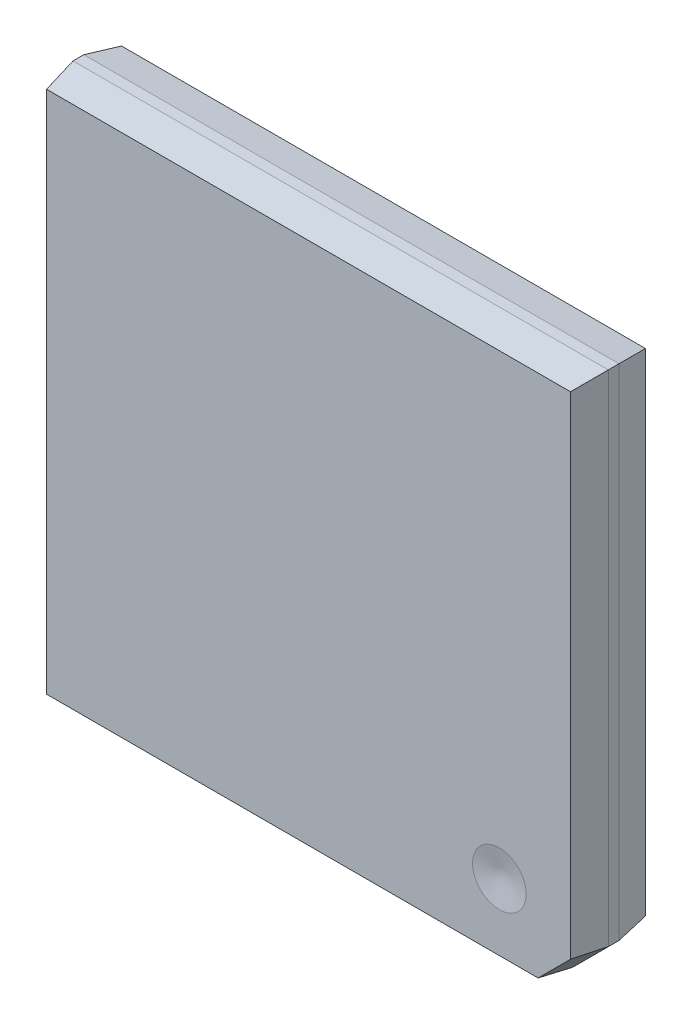
ISO-10303-21;
HEADER;
FILE_DESCRIPTION(('STEP AP214'),'2;1');
FILE_NAME('part.step','',(''),(''),'','','');
FILE_SCHEMA(('AUTOMOTIVE_DESIGN { 1 0 10303 214 1 1 1 1 }'));
ENDSEC;
DATA;
#1=APPLICATION_CONTEXT('core data for automotive mechanical design processes');
#2=APPLICATION_PROTOCOL_DEFINITION('international standard','automotive_design',2000,#1);
#3=PRODUCT_CONTEXT('',#1,'mechanical');
#4=PRODUCT('Part','Part','',(#3));
#5=PRODUCT_RELATED_PRODUCT_CATEGORY('part','',(#4));
#6=PRODUCT_DEFINITION_FORMATION('','',#4);
#7=PRODUCT_DEFINITION_CONTEXT('part definition',#1,'design');
#8=PRODUCT_DEFINITION('design','',#6,#7);
#9=PRODUCT_DEFINITION_SHAPE('','',#8);
#10=(LENGTH_UNIT() NAMED_UNIT(*) SI_UNIT(.MILLI.,.METRE.));
#11=(NAMED_UNIT(*) PLANE_ANGLE_UNIT() SI_UNIT($,.RADIAN.));
#12=(NAMED_UNIT(*) SI_UNIT($,.STERADIAN.) SOLID_ANGLE_UNIT());
#13=UNCERTAINTY_MEASURE_WITH_UNIT(LENGTH_MEASURE(1.E-05),#10,'distance_accuracy_value','');
#14=(GEOMETRIC_REPRESENTATION_CONTEXT(3) GLOBAL_UNCERTAINTY_ASSIGNED_CONTEXT((#13)) GLOBAL_UNIT_ASSIGNED_CONTEXT((#10,
#11,#12)) REPRESENTATION_CONTEXT('',''));
#15=CARTESIAN_POINT('',(0.,0.,0.));
#16=DIRECTION('',(0.,0.,1.));
#17=DIRECTION('',(1.,0.,0.));
#18=AXIS2_PLACEMENT_3D('',#15,#16,#17);
#19=CARTESIAN_POINT('',(3.56472313404083,-3.64965915679932,1.44999999999129));
#20=DIRECTION('',(0.,0.,1.));
#21=DIRECTION('',(1.,0.,0.));
#22=AXIS2_PLACEMENT_3D('',#19,#20,#21);
#23=CONICAL_SURFACE('',#22,0.499999999938157,1.39626340145883);
#24=CARTESIAN_POINT('',(3.56469270837351,-3.64965915679933,1.36210771992751));
#25=VERTEX_POINT('',#24);
#26=VERTEX_LOOP('',#25);
#27=FACE_BOUND('',#26,.T.);
#28=CARTESIAN_POINT('',(3.56472313404083,-3.64965915679932,1.45000000000131));
#29=DIRECTION('',(0.,0.,1.));
#30=DIRECTION('',(1.,0.,0.));
#31=AXIS2_PLACEMENT_3D('',#28,#29,#30);
#32=CIRCLE('',#31,0.499999999995001);
#33=CARTESIAN_POINT('',(4.06472313403583,-3.64965915679932,1.45000000000131));
#34=VERTEX_POINT('',#33);
#35=EDGE_CURVE('E20',#34,#34,#32,.T.);
#36=ORIENTED_EDGE('',*,*,#35,.T.);
#37=EDGE_LOOP('',(#36));
#38=FACE_BOUND('',#37,.T.);
#39=ADVANCED_FACE('F17',(#27,#38),#23,.F.);
#40=CARTESIAN_POINT('',(0.,0.,1.45));
#41=DIRECTION('',(0.,0.,-1.));
#42=DIRECTION('',(-1.,0.,0.));
#43=AXIS2_PLACEMENT_3D('',#40,#41,#42);
#44=PLANE('',#43);
#45=ORIENTED_EDGE('',*,*,#35,.F.);
#46=EDGE_LOOP('',(#45));
#47=FACE_BOUND('',#46,.T.);
#48=DIRECTION('',(1.,0.,0.));
#49=VECTOR('',#48,1.);
#50=CARTESIAN_POINT('',(-5.,-4.89420381157492,1.45));
#51=LINE('',#50,#49);
#52=CARTESIAN_POINT('',(-4.89420381157492,-4.89420381157492,1.45));
#53=VERTEX_POINT('',#52);
#54=CARTESIAN_POINT('',(4.28917778390695,-4.89420381157492,1.45));
#55=VERTEX_POINT('',#54);
#56=EDGE_CURVE('E95',#53,#55,#51,.T.);
#57=ORIENTED_EDGE('',*,*,#56,.T.);
#58=DIRECTION('',(-0.707106781186549,-0.707106781186546,0.));
#59=VECTOR('',#58,1.);
#60=CARTESIAN_POINT('',(4.25819079774094,-4.92519079774094,1.45));
#61=LINE('',#60,#59);
#62=CARTESIAN_POINT('',(4.89420381157492,-4.28917778390695,1.45));
#63=VERTEX_POINT('',#62);
#64=EDGE_CURVE('E106',#55,#63,#61,.F.);
#65=ORIENTED_EDGE('',*,*,#64,.T.);
#66=DIRECTION('',(0.,1.,0.));
#67=VECTOR('',#66,1.);
#68=CARTESIAN_POINT('',(4.89420381157492,-4.333,1.45));
#69=LINE('',#68,#67);
#70=CARTESIAN_POINT('',(4.89420381157492,4.89420381157492,1.45));
#71=VERTEX_POINT('',#70);
#72=EDGE_CURVE('E134',#63,#71,#69,.T.);
#73=ORIENTED_EDGE('',*,*,#72,.T.);
#74=DIRECTION('',(1.,0.,0.));
#75=VECTOR('',#74,1.);
#76=CARTESIAN_POINT('',(5.,4.89420381157492,1.45));
#77=LINE('',#76,#75);
#78=CARTESIAN_POINT('',(-4.89420381157492,4.89420381157492,1.45));
#79=VERTEX_POINT('',#78);
#80=EDGE_CURVE('E125',#71,#79,#77,.F.);
#81=ORIENTED_EDGE('',*,*,#80,.T.);
#82=DIRECTION('',(0.,1.,0.));
#83=VECTOR('',#82,1.);
#84=CARTESIAN_POINT('',(-4.89420381157492,5.,1.45));
#85=LINE('',#84,#83);
#86=EDGE_CURVE('E119',#79,#53,#85,.F.);
#87=ORIENTED_EDGE('',*,*,#86,.T.);
#88=EDGE_LOOP('',(#57,#65,#73,#81,#87));
#89=FACE_BOUND('',#88,.T.);
#90=ADVANCED_FACE('F101',(#47,#89),#44,.F.);
#91=CARTESIAN_POINT('',(4.333,-5.,0.85));
#92=DIRECTION('',(-0.696364240320018,0.69636424032002,-0.17364817766693));
#93=DIRECTION('',(-0.707106781186549,-0.707106781186546,0.));
#94=AXIS2_PLACEMENT_3D('',#91,#92,#93);
#95=PLANE('',#94);
#96=DIRECTION('',(-0.173200723896951,0.0717420888509582,0.982270116581418));
#97=VECTOR('',#96,1.);
#98=CARTESIAN_POINT('',(5.,-4.333,0.85));
#99=LINE('',#98,#97);
#100=CARTESIAN_POINT('',(5.,-4.333,0.85));
#101=VERTEX_POINT('',#100);
#102=EDGE_CURVE('E131',#101,#63,#99,.T.);
#103=ORIENTED_EDGE('',*,*,#102,.T.);
#104=ORIENTED_EDGE('',*,*,#64,.F.);
#105=DIRECTION('',(0.0717420888509554,-0.173200723896954,-0.982270116581418));
#106=VECTOR('',#105,1.);
#107=CARTESIAN_POINT('',(4.28917778390696,-4.89420381157492,1.45));
#108=LINE('',#107,#106);
#109=CARTESIAN_POINT('',(4.333,-5.,0.85));
#110=VERTEX_POINT('',#109);
#111=EDGE_CURVE('E115',#55,#110,#108,.T.);
#112=ORIENTED_EDGE('',*,*,#111,.T.);
#113=DIRECTION('',(0.707106781186548,0.707106781186547,0.));
#114=VECTOR('',#113,1.);
#115=CARTESIAN_POINT('',(5.,-4.333,0.85));
#116=LINE('',#115,#114);
#117=EDGE_CURVE('E140',#101,#110,#116,.F.);
#118=ORIENTED_EDGE('',*,*,#117,.F.);
#119=EDGE_LOOP('',(#103,#104,#112,#118));
#120=FACE_BOUND('',#119,.T.);
#121=ADVANCED_FACE('F271',(#120),#95,.F.);
#122=CARTESIAN_POINT('',(-5.,-5.,0.85));
#123=DIRECTION('',(0.,0.984807753012208,-0.173648177666931));
#124=DIRECTION('',(0.,0.173648177666931,0.984807753012208));
#125=AXIS2_PLACEMENT_3D('',#122,#123,#124);
#126=PLANE('',#125);
#127=ORIENTED_EDGE('',*,*,#111,.F.);
#128=ORIENTED_EDGE('',*,*,#56,.F.);
#129=DIRECTION('',(-0.171087869746036,-0.171087869746042,-0.970287525247813));
#130=VECTOR('',#129,1.);
#131=CARTESIAN_POINT('',(-4.89420381157492,-4.89420381157493,1.45));
#132=LINE('',#131,#130);
#133=CARTESIAN_POINT('',(-5.,-5.,0.85));
#134=VERTEX_POINT('',#133);
#135=EDGE_CURVE('E122',#53,#134,#132,.T.);
#136=ORIENTED_EDGE('',*,*,#135,.T.);
#137=DIRECTION('',(1.,0.,0.));
#138=VECTOR('',#137,1.);
#139=CARTESIAN_POINT('',(4.333,-5.,0.85));
#140=LINE('',#139,#138);
#141=EDGE_CURVE('E148',#110,#134,#140,.F.);
#142=ORIENTED_EDGE('',*,*,#141,.F.);
#143=EDGE_LOOP('',(#127,#128,#136,#142));
#144=FACE_BOUND('',#143,.T.);
#145=ADVANCED_FACE('F408',(#144),#126,.F.);
#146=CARTESIAN_POINT('',(-5.,5.,0.85));
#147=DIRECTION('',(0.984807753012208,0.,-0.173648177666931));
#148=DIRECTION('',(-0.173648177666931,0.,-0.984807753012208));
#149=AXIS2_PLACEMENT_3D('',#146,#147,#148);
#150=PLANE('',#149);
#151=ORIENTED_EDGE('',*,*,#135,.F.);
#152=ORIENTED_EDGE('',*,*,#86,.F.);
#153=DIRECTION('',(-0.171087869746031,0.171087869746036,-0.970287525247815));
#154=VECTOR('',#153,1.);
#155=CARTESIAN_POINT('',(-4.89420381157493,4.89420381157492,1.45));
#156=LINE('',#155,#154);
#157=CARTESIAN_POINT('',(-5.,5.,0.85));
#158=VERTEX_POINT('',#157);
#159=EDGE_CURVE('E128',#79,#158,#156,.T.);
#160=ORIENTED_EDGE('',*,*,#159,.T.);
#161=DIRECTION('',(0.,-1.,0.));
#162=VECTOR('',#161,1.);
#163=CARTESIAN_POINT('',(-5.,-5.,0.85));
#164=LINE('',#163,#162);
#165=EDGE_CURVE('E156',#134,#158,#164,.F.);
#166=ORIENTED_EDGE('',*,*,#165,.F.);
#167=EDGE_LOOP('',(#151,#152,#160,#166));
#168=FACE_BOUND('',#167,.T.);
#169=ADVANCED_FACE('F399',(#168),#150,.F.);
#170=CARTESIAN_POINT('',(5.,5.,0.85));
#171=DIRECTION('',(0.,-0.984807753012208,-0.173648177666931));
#172=DIRECTION('',(0.,0.173648177666931,-0.984807753012208));
#173=AXIS2_PLACEMENT_3D('',#170,#171,#172);
#174=PLANE('',#173);
#175=ORIENTED_EDGE('',*,*,#159,.F.);
#176=ORIENTED_EDGE('',*,*,#80,.F.);
#177=DIRECTION('',(0.171087869746033,0.171087869746039,-0.970287525247814));
#178=VECTOR('',#177,1.);
#179=CARTESIAN_POINT('',(4.89420381157492,4.89420381157492,1.45));
#180=LINE('',#179,#178);
#181=CARTESIAN_POINT('',(5.,5.,0.85));
#182=VERTEX_POINT('',#181);
#183=EDGE_CURVE('E137',#71,#182,#180,.T.);
#184=ORIENTED_EDGE('',*,*,#183,.T.);
#185=DIRECTION('',(1.,0.,0.));
#186=VECTOR('',#185,1.);
#187=CARTESIAN_POINT('',(-5.,5.,0.85));
#188=LINE('',#187,#186);
#189=EDGE_CURVE('E163',#158,#182,#188,.T.);
#190=ORIENTED_EDGE('',*,*,#189,.F.);
#191=EDGE_LOOP('',(#175,#176,#184,#190));
#192=FACE_BOUND('',#191,.T.);
#193=ADVANCED_FACE('F263',(#192),#174,.F.);
#194=CARTESIAN_POINT('',(5.,-4.333,0.85));
#195=DIRECTION('',(-0.984807753012208,0.,-0.173648177666928));
#196=DIRECTION('',(-0.173648177666928,0.,0.984807753012208));
#197=AXIS2_PLACEMENT_3D('',#194,#195,#196);
#198=PLANE('',#197);
#199=ORIENTED_EDGE('',*,*,#183,.F.);
#200=ORIENTED_EDGE('',*,*,#72,.F.);
#201=ORIENTED_EDGE('',*,*,#102,.F.);
#202=DIRECTION('',(0.,1.,0.));
#203=VECTOR('',#202,1.);
#204=CARTESIAN_POINT('',(5.,5.,0.85));
#205=LINE('',#204,#203);
#206=EDGE_CURVE('E174',#182,#101,#205,.F.);
#207=ORIENTED_EDGE('',*,*,#206,.F.);
#208=EDGE_LOOP('',(#199,#200,#201,#207));
#209=FACE_BOUND('',#208,.T.);
#210=ADVANCED_FACE('F268',(#209),#198,.F.);
#211=CARTESIAN_POINT('',(5.,-4.333,0.75));
#212=DIRECTION('',(0.707106781186547,-0.707106781186548,0.));
#213=DIRECTION('',(0.707106781186548,0.707106781186547,0.));
#214=AXIS2_PLACEMENT_3D('',#211,#212,#213);
#215=PLANE('',#214);
#216=DIRECTION('',(0.,0.,1.));
#217=VECTOR('',#216,1.);
#218=CARTESIAN_POINT('',(5.,-4.333,0.75));
#219=LINE('',#218,#217);
#220=CARTESIAN_POINT('',(5.,-4.333,0.65));
#221=VERTEX_POINT('',#220);
#222=EDGE_CURVE('E167',#101,#221,#219,.F.);
#223=ORIENTED_EDGE('',*,*,#222,.F.);
#224=ORIENTED_EDGE('',*,*,#117,.T.);
#225=DIRECTION('',(0.,0.,1.));
#226=VECTOR('',#225,1.);
#227=CARTESIAN_POINT('',(4.333,-5.,0.75));
#228=LINE('',#227,#226);
#229=CARTESIAN_POINT('',(4.333,-5.,0.65));
#230=VERTEX_POINT('',#229);
#231=EDGE_CURVE('E144',#230,#110,#228,.T.);
#232=ORIENTED_EDGE('',*,*,#231,.F.);
#233=DIRECTION('',(0.707106781186549,0.707106781186546,0.));
#234=VECTOR('',#233,1.);
#235=CARTESIAN_POINT('',(4.333,-5.,0.65));
#236=LINE('',#235,#234);
#237=EDGE_CURVE('E178',#221,#230,#236,.F.);
#238=ORIENTED_EDGE('',*,*,#237,.F.);
#239=EDGE_LOOP('',(#223,#224,#232,#238));
#240=FACE_BOUND('',#239,.T.);
#241=ADVANCED_FACE('F274',(#240),#215,.T.);
#242=CARTESIAN_POINT('',(4.333,-5.,0.75));
#243=DIRECTION('',(0.,-1.,0.));
#244=DIRECTION('',(1.,0.,0.));
#245=AXIS2_PLACEMENT_3D('',#242,#243,#244);
#246=PLANE('',#245);
#247=ORIENTED_EDGE('',*,*,#231,.T.);
#248=ORIENTED_EDGE('',*,*,#141,.T.);
#249=DIRECTION('',(0.,0.,1.));
#250=VECTOR('',#249,1.);
#251=CARTESIAN_POINT('',(-5.,-5.,0.75));
#252=LINE('',#251,#250);
#253=CARTESIAN_POINT('',(-5.,-5.,0.65));
#254=VERTEX_POINT('',#253);
#255=EDGE_CURVE('E152',#254,#134,#252,.T.);
#256=ORIENTED_EDGE('',*,*,#255,.F.);
#257=DIRECTION('',(1.,0.,0.));
#258=VECTOR('',#257,1.);
#259=CARTESIAN_POINT('',(-5.,-5.,0.65));
#260=LINE('',#259,#258);
#261=EDGE_CURVE('E186',#230,#254,#260,.F.);
#262=ORIENTED_EDGE('',*,*,#261,.F.);
#263=EDGE_LOOP('',(#247,#248,#256,#262));
#264=FACE_BOUND('',#263,.T.);
#265=ADVANCED_FACE('F255',(#264),#246,.T.);
#266=CARTESIAN_POINT('',(-5.,-5.,0.75));
#267=DIRECTION('',(-1.,0.,0.));
#268=DIRECTION('',(0.,-1.,0.));
#269=AXIS2_PLACEMENT_3D('',#266,#267,#268);
#270=PLANE('',#269);
#271=ORIENTED_EDGE('',*,*,#255,.T.);
#272=ORIENTED_EDGE('',*,*,#165,.T.);
#273=DIRECTION('',(0.,0.,1.));
#274=VECTOR('',#273,1.);
#275=CARTESIAN_POINT('',(-5.,5.,0.75));
#276=LINE('',#275,#274);
#277=CARTESIAN_POINT('',(-5.,5.,0.65));
#278=VERTEX_POINT('',#277);
#279=EDGE_CURVE('E160',#278,#158,#276,.T.);
#280=ORIENTED_EDGE('',*,*,#279,.F.);
#281=DIRECTION('',(0.,1.,0.));
#282=VECTOR('',#281,1.);
#283=CARTESIAN_POINT('',(-5.,5.,0.65));
#284=LINE('',#283,#282);
#285=EDGE_CURVE('E194',#254,#278,#284,.T.);
#286=ORIENTED_EDGE('',*,*,#285,.F.);
#287=EDGE_LOOP('',(#271,#272,#280,#286));
#288=FACE_BOUND('',#287,.T.);
#289=ADVANCED_FACE('F258',(#288),#270,.T.);
#290=CARTESIAN_POINT('',(-5.,5.,0.75));
#291=DIRECTION('',(0.,1.,0.));
#292=DIRECTION('',(0.,0.,1.));
#293=AXIS2_PLACEMENT_3D('',#290,#291,#292);
#294=PLANE('',#293);
#295=ORIENTED_EDGE('',*,*,#279,.T.);
#296=ORIENTED_EDGE('',*,*,#189,.T.);
#297=DIRECTION('',(0.,0.,1.));
#298=VECTOR('',#297,1.);
#299=CARTESIAN_POINT('',(5.,5.,0.75));
#300=LINE('',#299,#298);
#301=CARTESIAN_POINT('',(5.,5.,0.65));
#302=VERTEX_POINT('',#301);
#303=EDGE_CURVE('E171',#302,#182,#300,.T.);
#304=ORIENTED_EDGE('',*,*,#303,.F.);
#305=DIRECTION('',(1.,0.,0.));
#306=VECTOR('',#305,1.);
#307=CARTESIAN_POINT('',(5.,5.,0.65));
#308=LINE('',#307,#306);
#309=EDGE_CURVE('E201',#278,#302,#308,.T.);
#310=ORIENTED_EDGE('',*,*,#309,.F.);
#311=EDGE_LOOP('',(#295,#296,#304,#310));
#312=FACE_BOUND('',#311,.T.);
#313=ADVANCED_FACE('F239',(#312),#294,.T.);
#314=CARTESIAN_POINT('',(5.,5.,0.75));
#315=DIRECTION('',(1.,0.,0.));
#316=DIRECTION('',(0.,1.,0.));
#317=AXIS2_PLACEMENT_3D('',#314,#315,#316);
#318=PLANE('',#317);
#319=ORIENTED_EDGE('',*,*,#303,.T.);
#320=ORIENTED_EDGE('',*,*,#206,.T.);
#321=ORIENTED_EDGE('',*,*,#222,.T.);
#322=DIRECTION('',(0.,1.,0.));
#323=VECTOR('',#322,1.);
#324=CARTESIAN_POINT('',(5.,-4.333,0.65));
#325=LINE('',#324,#323);
#326=EDGE_CURVE('E206',#302,#221,#325,.F.);
#327=ORIENTED_EDGE('',*,*,#326,.F.);
#328=EDGE_LOOP('',(#319,#320,#321,#327));
#329=FACE_BOUND('',#328,.T.);
#330=ADVANCED_FACE('F243',(#329),#318,.T.);
#331=CARTESIAN_POINT('',(4.333,-5.,0.65));
#332=DIRECTION('',(0.696364240320018,-0.69636424032002,-0.17364817766693));
#333=DIRECTION('',(0.707106781186549,0.707106781186546,0.));
#334=AXIS2_PLACEMENT_3D('',#331,#332,#333);
#335=PLANE('',#334);
#336=ORIENTED_EDGE('',*,*,#237,.T.);
#337=DIRECTION('',(0.0717420888509582,-0.173200723896954,0.982270116581418));
#338=VECTOR('',#337,1.);
#339=CARTESIAN_POINT('',(4.28917778390696,-4.89420381157492,0.05));
#340=LINE('',#339,#338);
#341=CARTESIAN_POINT('',(4.28917778390695,-4.89420381157492,0.05));
#342=VERTEX_POINT('',#341);
#343=EDGE_CURVE('E182',#342,#230,#340,.T.);
#344=ORIENTED_EDGE('',*,*,#343,.F.);
#345=DIRECTION('',(-0.707106781186547,-0.707106781186548,0.));
#346=VECTOR('',#345,1.);
#347=CARTESIAN_POINT('',(4.89420381157492,-4.28917778390695,0.0500000000000001));
#348=LINE('',#347,#346);
#349=CARTESIAN_POINT('',(4.89420381157492,-4.28917778390695,0.0499999999999998));
#350=VERTEX_POINT('',#349);
#351=EDGE_CURVE('E214',#350,#342,#348,.T.);
#352=ORIENTED_EDGE('',*,*,#351,.F.);
#353=DIRECTION('',(-0.173200723896951,0.0717420888509582,-0.982270116581418));
#354=VECTOR('',#353,1.);
#355=CARTESIAN_POINT('',(5.,-4.333,0.65));
#356=LINE('',#355,#354);
#357=EDGE_CURVE('E210',#221,#350,#356,.T.);
#358=ORIENTED_EDGE('',*,*,#357,.F.);
#359=EDGE_LOOP('',(#336,#344,#352,#358));
#360=FACE_BOUND('',#359,.T.);
#361=ADVANCED_FACE('F249',(#360),#335,.T.);
#362=CARTESIAN_POINT('',(-5.,-5.,0.65));
#363=DIRECTION('',(0.,-0.984807753012208,-0.173648177666931));
#364=DIRECTION('',(0.,0.173648177666931,-0.984807753012208));
#365=AXIS2_PLACEMENT_3D('',#362,#363,#364);
#366=PLANE('',#365);
#367=ORIENTED_EDGE('',*,*,#261,.T.);
#368=DIRECTION('',(-0.171087869746036,-0.171087869746036,0.970287525247814));
#369=VECTOR('',#368,1.);
#370=CARTESIAN_POINT('',(-4.89420381157492,-4.89420381157493,0.0499999999999991));
#371=LINE('',#370,#369);
#372=CARTESIAN_POINT('',(-4.89420381157492,-4.89420381157492,0.0499999999999999));
#373=VERTEX_POINT('',#372);
#374=EDGE_CURVE('E190',#373,#254,#371,.T.);
#375=ORIENTED_EDGE('',*,*,#374,.F.);
#376=DIRECTION('',(-1.,0.,0.));
#377=VECTOR('',#376,1.);
#378=CARTESIAN_POINT('',(0.,-4.89420381157492,0.0500000000000001));
#379=LINE('',#378,#377);
#380=EDGE_CURVE('E218',#342,#373,#379,.T.);
#381=ORIENTED_EDGE('',*,*,#380,.F.);
#382=ORIENTED_EDGE('',*,*,#343,.T.);
#383=EDGE_LOOP('',(#367,#375,#381,#382));
#384=FACE_BOUND('',#383,.T.);
#385=ADVANCED_FACE('F253',(#384),#366,.T.);
#386=CARTESIAN_POINT('',(-5.,5.,0.65));
#387=DIRECTION('',(-0.984807753012208,0.,-0.173648177666931));
#388=DIRECTION('',(-0.173648177666931,0.,0.984807753012208));
#389=AXIS2_PLACEMENT_3D('',#386,#387,#388);
#390=PLANE('',#389);
#391=ORIENTED_EDGE('',*,*,#285,.T.);
#392=DIRECTION('',(-0.171087869746031,0.171087869746036,0.970287525247815));
#393=VECTOR('',#392,1.);
#394=CARTESIAN_POINT('',(-4.89420381157493,4.89420381157492,0.0499999999999999));
#395=LINE('',#394,#393);
#396=CARTESIAN_POINT('',(-4.89420381157492,4.89420381157492,0.0499999999999999));
#397=VERTEX_POINT('',#396);
#398=EDGE_CURVE('E198',#397,#278,#395,.T.);
#399=ORIENTED_EDGE('',*,*,#398,.F.);
#400=DIRECTION('',(0.,1.,0.));
#401=VECTOR('',#400,1.);
#402=CARTESIAN_POINT('',(-4.89420381157492,0.,0.0500000000000001));
#403=LINE('',#402,#401);
#404=EDGE_CURVE('E222',#373,#397,#403,.T.);
#405=ORIENTED_EDGE('',*,*,#404,.F.);
#406=ORIENTED_EDGE('',*,*,#374,.T.);
#407=EDGE_LOOP('',(#391,#399,#405,#406));
#408=FACE_BOUND('',#407,.T.);
#409=ADVANCED_FACE('F235',(#408),#390,.T.);
#410=CARTESIAN_POINT('',(5.,5.,0.65));
#411=DIRECTION('',(0.,0.984807753012208,-0.173648177666931));
#412=DIRECTION('',(0.,0.173648177666931,0.984807753012208));
#413=AXIS2_PLACEMENT_3D('',#410,#411,#412);
#414=PLANE('',#413);
#415=ORIENTED_EDGE('',*,*,#309,.T.);
#416=DIRECTION('',(0.171087869746033,0.171087869746039,0.970287525247814));
#417=VECTOR('',#416,1.);
#418=CARTESIAN_POINT('',(4.89420381157492,4.89420381157492,0.0499999999999997));
#419=LINE('',#418,#417);
#420=CARTESIAN_POINT('',(4.89420381157492,4.89420381157492,0.0499999999999998));
#421=VERTEX_POINT('',#420);
#422=EDGE_CURVE('E36',#421,#302,#419,.T.);
#423=ORIENTED_EDGE('',*,*,#422,.F.);
#424=DIRECTION('',(-1.,0.,0.));
#425=VECTOR('',#424,1.);
#426=CARTESIAN_POINT('',(0.,4.89420381157492,0.0500000000000001));
#427=LINE('',#426,#425);
#428=EDGE_CURVE('E27',#397,#421,#427,.F.);
#429=ORIENTED_EDGE('',*,*,#428,.F.);
#430=ORIENTED_EDGE('',*,*,#398,.T.);
#431=EDGE_LOOP('',(#415,#423,#429,#430));
#432=FACE_BOUND('',#431,.T.);
#433=ADVANCED_FACE('F231',(#432),#414,.T.);
#434=CARTESIAN_POINT('',(5.,-4.333,0.65));
#435=DIRECTION('',(0.984807753012208,0.,-0.173648177666928));
#436=DIRECTION('',(-0.173648177666928,0.,-0.984807753012208));
#437=AXIS2_PLACEMENT_3D('',#434,#435,#436);
#438=PLANE('',#437);
#439=ORIENTED_EDGE('',*,*,#326,.T.);
#440=ORIENTED_EDGE('',*,*,#357,.T.);
#441=DIRECTION('',(0.,1.,0.));
#442=VECTOR('',#441,1.);
#443=CARTESIAN_POINT('',(4.89420381157492,0.,0.0500000000000001));
#444=LINE('',#443,#442);
#445=EDGE_CURVE('E11',#421,#350,#444,.F.);
#446=ORIENTED_EDGE('',*,*,#445,.F.);
#447=ORIENTED_EDGE('',*,*,#422,.T.);
#448=EDGE_LOOP('',(#439,#440,#446,#447));
#449=FACE_BOUND('',#448,.T.);
#450=ADVANCED_FACE('F247',(#449),#438,.T.);
#451=CARTESIAN_POINT('',(0.,0.,0.0500000000000001));
#452=DIRECTION('',(0.,0.,-1.));
#453=DIRECTION('',(-1.,0.,0.));
#454=AXIS2_PLACEMENT_3D('',#451,#452,#453);
#455=PLANE('',#454);
#456=ORIENTED_EDGE('',*,*,#428,.T.);
#457=ORIENTED_EDGE('',*,*,#445,.T.);
#458=ORIENTED_EDGE('',*,*,#351,.T.);
#459=ORIENTED_EDGE('',*,*,#380,.T.);
#460=ORIENTED_EDGE('',*,*,#404,.T.);
#461=EDGE_LOOP('',(#456,#457,#458,#459,#460));
#462=FACE_BOUND('',#461,.T.);
#463=ADVANCED_FACE('F229',(#462),#455,.T.);
#464=CLOSED_SHELL('',(#39,#90,#121,#145,#169,#193,#210,#241,#265,#289,#313,#330,#361,#385,#409,
#433,#450,#463));
#465=MANIFOLD_SOLID_BREP('B1',#464);
#466=ADVANCED_BREP_SHAPE_REPRESENTATION('',(#18,#465),#14);
#467=SHAPE_DEFINITION_REPRESENTATION(#9,#466);
ENDSEC;
END-ISO-10303-21;
